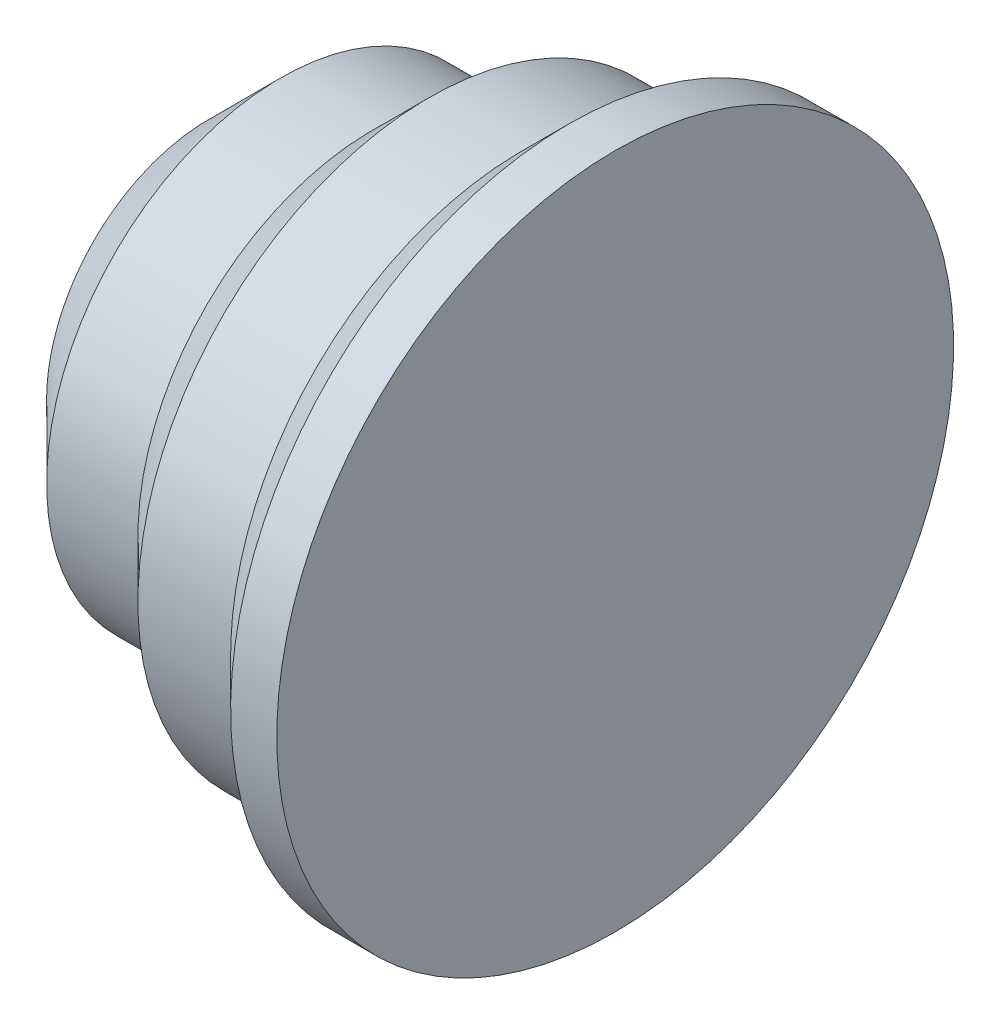
ISO-10303-21;
HEADER;
FILE_DESCRIPTION(('STEP AP214'),'2;1');
FILE_NAME('part.step','',(''),(''),'','','');
FILE_SCHEMA(('AUTOMOTIVE_DESIGN { 1 0 10303 214 1 1 1 1 }'));
ENDSEC;
DATA;
#1=APPLICATION_CONTEXT('core data for automotive mechanical design processes');
#2=APPLICATION_PROTOCOL_DEFINITION('international standard','automotive_design',2000,#1);
#3=PRODUCT_CONTEXT('',#1,'mechanical');
#4=PRODUCT('Part','Part','',(#3));
#5=PRODUCT_RELATED_PRODUCT_CATEGORY('part','',(#4));
#6=PRODUCT_DEFINITION_FORMATION('','',#4);
#7=PRODUCT_DEFINITION_CONTEXT('part definition',#1,'design');
#8=PRODUCT_DEFINITION('design','',#6,#7);
#9=PRODUCT_DEFINITION_SHAPE('','',#8);
#10=(LENGTH_UNIT() NAMED_UNIT(*) SI_UNIT(.MILLI.,.METRE.));
#11=(NAMED_UNIT(*) PLANE_ANGLE_UNIT() SI_UNIT($,.RADIAN.));
#12=(NAMED_UNIT(*) SI_UNIT($,.STERADIAN.) SOLID_ANGLE_UNIT());
#13=UNCERTAINTY_MEASURE_WITH_UNIT(LENGTH_MEASURE(1.E-05),#10,'distance_accuracy_value','');
#14=(GEOMETRIC_REPRESENTATION_CONTEXT(3) GLOBAL_UNCERTAINTY_ASSIGNED_CONTEXT((#13)) GLOBAL_UNIT_ASSIGNED_CONTEXT((#10,
#11,#12)) REPRESENTATION_CONTEXT('',''));
#15=CARTESIAN_POINT('',(0.,0.,0.));
#16=DIRECTION('',(0.,0.,1.));
#17=DIRECTION('',(1.,0.,0.));
#18=AXIS2_PLACEMENT_3D('',#15,#16,#17);
#19=CARTESIAN_POINT('',(148.259885267244,0.,-17.7800000005563));
#20=DIRECTION('',(0.,0.,1.));
#21=DIRECTION('',(-1.,0.,0.));
#22=AXIS2_PLACEMENT_3D('',#19,#20,#21);
#23=SPHERICAL_SURFACE('',#22,15.7176245464);
#24=CARTESIAN_POINT('',(151.2775098142,0.,-17.78));
#25=DIRECTION('',(1.,0.,0.));
#26=DIRECTION('',(0.,0.,-1.));
#27=AXIS2_PLACEMENT_3D('',#24,#25,#26);
#28=CIRCLE('',#27,15.4252281538);
#29=CARTESIAN_POINT('',(151.2775098142,0.,-33.2052281538));
#30=VERTEX_POINT('',#29);
#31=EDGE_CURVE('E19',#30,#30,#28,.F.);
#32=ORIENTED_EDGE('',*,*,#31,.T.);
#33=EDGE_LOOP('',(#32));
#34=FACE_BOUND('',#33,.T.);
#35=ADVANCED_FACE('F15',(#34),#23,.F.);
#36=CARTESIAN_POINT('',(151.2775098142,0.,-17.78));
#37=DIRECTION('',(1.,0.,0.));
#38=DIRECTION('',(0.,0.,-1.));
#39=AXIS2_PLACEMENT_3D('',#36,#37,#38);
#40=CONICAL_SURFACE('',#39,15.4252281538,0.785398163397451);
#41=CARTESIAN_POINT('',(158.1446183558,0.,-17.78));
#42=DIRECTION('',(1.,0.,0.));
#43=DIRECTION('',(0.,0.,-1.));
#44=AXIS2_PLACEMENT_3D('',#41,#42,#43);
#45=CIRCLE('',#44,22.2923366954);
#46=CARTESIAN_POINT('',(158.1446183558,0.,-40.0723366954));
#47=VERTEX_POINT('',#46);
#48=EDGE_CURVE('E32',#47,#47,#45,.F.);
#49=ORIENTED_EDGE('',*,*,#48,.T.);
#50=EDGE_LOOP('',(#49));
#51=FACE_BOUND('',#50,.T.);
#52=ORIENTED_EDGE('',*,*,#31,.F.);
#53=EDGE_LOOP('',(#52));
#54=FACE_BOUND('',#53,.T.);
#55=ADVANCED_FACE('F36',(#51,#54),#40,.T.);
#56=CARTESIAN_POINT('',(158.1446183558,0.,-17.78));
#57=DIRECTION('',(1.,0.,0.));
#58=DIRECTION('',(0.,0.,-1.));
#59=AXIS2_PLACEMENT_3D('',#56,#57,#58);
#60=CYLINDRICAL_SURFACE('',#59,22.2923366954);
#61=CARTESIAN_POINT('',(166.8395388628,0.,-17.78));
#62=DIRECTION('',(1.,0.,0.));
#63=DIRECTION('',(0.,0.,-1.));
#64=AXIS2_PLACEMENT_3D('',#61,#62,#63);
#65=CIRCLE('',#64,22.2923366954);
#66=CARTESIAN_POINT('',(166.8395388628,0.,-40.0723366954));
#67=VERTEX_POINT('',#66);
#68=EDGE_CURVE('E72',#67,#67,#65,.F.);
#69=ORIENTED_EDGE('',*,*,#68,.T.);
#70=EDGE_LOOP('',(#69));
#71=FACE_BOUND('',#70,.T.);
#72=ORIENTED_EDGE('',*,*,#48,.F.);
#73=EDGE_LOOP('',(#72));
#74=FACE_BOUND('',#73,.T.);
#75=ADVANCED_FACE('F40',(#71,#74),#60,.T.);
#76=CARTESIAN_POINT('',(166.8395388628,0.,-17.78));
#77=DIRECTION('',(1.,0.,0.));
#78=DIRECTION('',(0.,0.,-1.));
#79=AXIS2_PLACEMENT_3D('',#76,#77,#78);
#80=CONICAL_SURFACE('',#79,22.2923366954,0.785398163397448);
#81=CARTESIAN_POINT('',(172.281771768,0.,-17.78));
#82=DIRECTION('',(1.,0.,0.));
#83=DIRECTION('',(0.,0.,-1.));
#84=AXIS2_PLACEMENT_3D('',#81,#82,#83);
#85=CIRCLE('',#84,27.7345696006);
#86=CARTESIAN_POINT('',(172.281771768,0.,-45.5145696006));
#87=VERTEX_POINT('',#86);
#88=EDGE_CURVE('E69',#87,#87,#85,.F.);
#89=ORIENTED_EDGE('',*,*,#88,.T.);
#90=EDGE_LOOP('',(#89));
#91=FACE_BOUND('',#90,.T.);
#92=ORIENTED_EDGE('',*,*,#68,.F.);
#93=EDGE_LOOP('',(#92));
#94=FACE_BOUND('',#93,.T.);
#95=ADVANCED_FACE('F44',(#91,#94),#80,.T.);
#96=CARTESIAN_POINT('',(172.281771768,0.,-17.78));
#97=DIRECTION('',(1.,0.,0.));
#98=DIRECTION('',(0.,0.,-1.));
#99=AXIS2_PLACEMENT_3D('',#96,#97,#98);
#100=CYLINDRICAL_SURFACE('',#99,27.7345696006);
#101=CARTESIAN_POINT('',(181.1077602374,0.,-17.78));
#102=DIRECTION('',(1.,0.,0.));
#103=DIRECTION('',(0.,0.,-1.));
#104=AXIS2_PLACEMENT_3D('',#101,#102,#103);
#105=CIRCLE('',#104,27.7345696006);
#106=CARTESIAN_POINT('',(181.1077602374,0.,-45.5145696006));
#107=VERTEX_POINT('',#106);
#108=EDGE_CURVE('E27',#107,#107,#105,.F.);
#109=ORIENTED_EDGE('',*,*,#108,.T.);
#110=EDGE_LOOP('',(#109));
#111=FACE_BOUND('',#110,.T.);
#112=ORIENTED_EDGE('',*,*,#88,.F.);
#113=EDGE_LOOP('',(#112));
#114=FACE_BOUND('',#113,.T.);
#115=ADVANCED_FACE('F48',(#111,#114),#100,.T.);
#116=CARTESIAN_POINT('',(181.1077602374,0.,-17.78));
#117=DIRECTION('',(1.,0.,0.));
#118=DIRECTION('',(0.,0.,-1.));
#119=AXIS2_PLACEMENT_3D('',#116,#117,#118);
#120=CONICAL_SURFACE('',#119,27.7345696006,0.785398163397452);
#121=CARTESIAN_POINT('',(185.6023230288,0.,-17.78));
#122=DIRECTION('',(1.,0.,0.));
#123=DIRECTION('',(0.,0.,-1.));
#124=AXIS2_PLACEMENT_3D('',#121,#122,#123);
#125=CIRCLE('',#124,32.229132392);
#126=CARTESIAN_POINT('',(185.6023230288,0.,-50.009132392));
#127=VERTEX_POINT('',#126);
#128=EDGE_CURVE('E23',#127,#127,#125,.F.);
#129=ORIENTED_EDGE('',*,*,#128,.T.);
#130=EDGE_LOOP('',(#129));
#131=FACE_BOUND('',#130,.T.);
#132=ORIENTED_EDGE('',*,*,#108,.F.);
#133=EDGE_LOOP('',(#132));
#134=FACE_BOUND('',#133,.T.);
#135=ADVANCED_FACE('F52',(#131,#134),#120,.T.);
#136=CARTESIAN_POINT('',(190.0020728526,-32.6158819868,14.8358819868));
#137=DIRECTION('',(1.,0.,0.));
#138=DIRECTION('',(0.,0.,-1.));
#139=AXIS2_PLACEMENT_3D('',#136,#137,#138);
#140=PLANE('',#139);
#141=CARTESIAN_POINT('',(190.0020728526,0.,-17.78));
#142=DIRECTION('',(1.,0.,0.));
#143=DIRECTION('',(0.,1.,0.));
#144=AXIS2_PLACEMENT_3D('',#141,#142,#143);
#145=CIRCLE('',#144,32.229132392);
#146=CARTESIAN_POINT('',(190.0020728526,32.229132392,-17.78));
#147=VERTEX_POINT('',#146);
#148=EDGE_CURVE('E10',#147,#147,#145,.T.);
#149=ORIENTED_EDGE('',*,*,#148,.T.);
#150=EDGE_LOOP('',(#149));
#151=FACE_BOUND('',#150,.T.);
#152=ADVANCED_FACE('F17',(#151),#140,.T.);
#153=CARTESIAN_POINT('',(185.6023230288,0.,-17.78));
#154=DIRECTION('',(1.,0.,0.));
#155=DIRECTION('',(0.,1.,0.));
#156=AXIS2_PLACEMENT_3D('',#153,#154,#155);
#157=CYLINDRICAL_SURFACE('',#156,32.229132392);
#158=ORIENTED_EDGE('',*,*,#148,.F.);
#159=EDGE_LOOP('',(#158));
#160=FACE_BOUND('',#159,.T.);
#161=ORIENTED_EDGE('',*,*,#128,.F.);
#162=EDGE_LOOP('',(#161));
#163=FACE_BOUND('',#162,.T.);
#164=ADVANCED_FACE('F57',(#160,#163),#157,.T.);
#165=CLOSED_SHELL('',(#35,#55,#75,#95,#115,#135,#152,#164));
#166=MANIFOLD_SOLID_BREP('B1',#165);
#167=ADVANCED_BREP_SHAPE_REPRESENTATION('',(#18,#166),#14);
#168=SHAPE_DEFINITION_REPRESENTATION(#9,#167);
ENDSEC;
END-ISO-10303-21;
